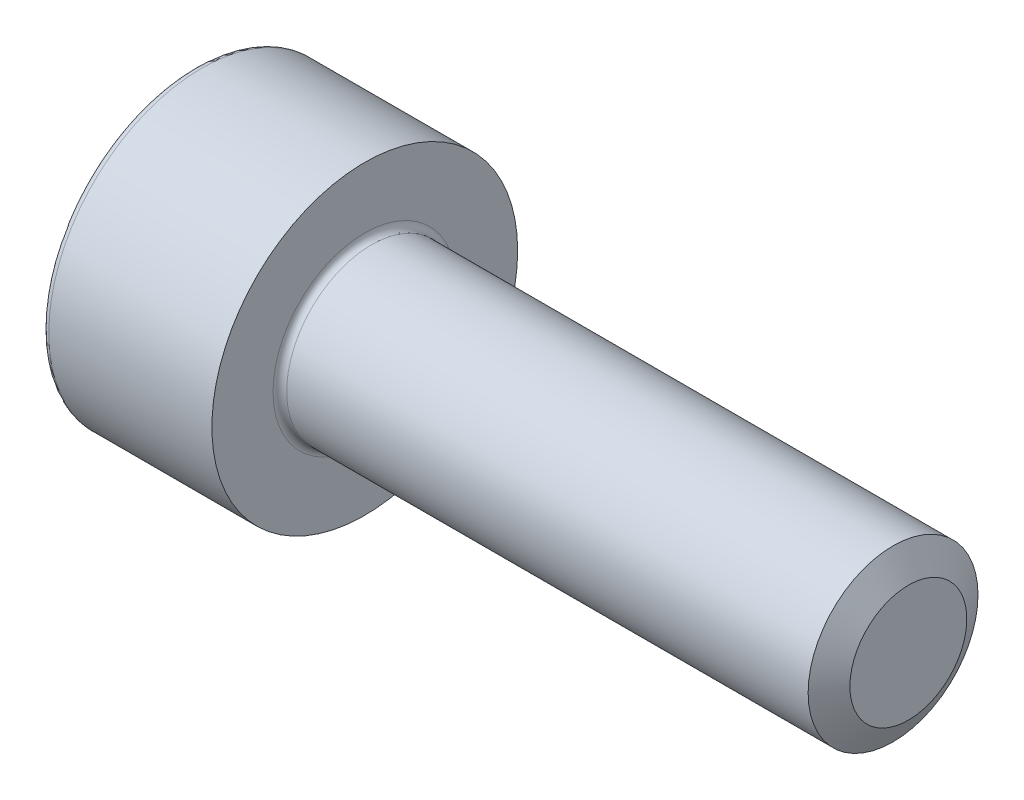
ISO-10303-21;
HEADER;
FILE_DESCRIPTION(('STEP AP214'),'2;1');
FILE_NAME('part.step','',(''),(''),'','','');
FILE_SCHEMA(('AUTOMOTIVE_DESIGN { 1 0 10303 214 1 1 1 1 }'));
ENDSEC;
DATA;
#1=APPLICATION_CONTEXT('core data for automotive mechanical design processes');
#2=APPLICATION_PROTOCOL_DEFINITION('international standard','automotive_design',2000,#1);
#3=PRODUCT_CONTEXT('',#1,'mechanical');
#4=PRODUCT('Part','Part','',(#3));
#5=PRODUCT_RELATED_PRODUCT_CATEGORY('part','',(#4));
#6=PRODUCT_DEFINITION_FORMATION('','',#4);
#7=PRODUCT_DEFINITION_CONTEXT('part definition',#1,'design');
#8=PRODUCT_DEFINITION('design','',#6,#7);
#9=PRODUCT_DEFINITION_SHAPE('','',#8);
#10=(LENGTH_UNIT() NAMED_UNIT(*) SI_UNIT(.MILLI.,.METRE.));
#11=(NAMED_UNIT(*) PLANE_ANGLE_UNIT() SI_UNIT($,.RADIAN.));
#12=(NAMED_UNIT(*) SI_UNIT($,.STERADIAN.) SOLID_ANGLE_UNIT());
#13=UNCERTAINTY_MEASURE_WITH_UNIT(LENGTH_MEASURE(1.E-05),#10,'distance_accuracy_value','');
#14=(GEOMETRIC_REPRESENTATION_CONTEXT(3) GLOBAL_UNCERTAINTY_ASSIGNED_CONTEXT((#13)) GLOBAL_UNIT_ASSIGNED_CONTEXT((#10,
#11,#12)) REPRESENTATION_CONTEXT('',''));
#15=CARTESIAN_POINT('',(0.,0.,0.));
#16=DIRECTION('',(0.,0.,1.));
#17=DIRECTION('',(1.,0.,0.));
#18=AXIS2_PLACEMENT_3D('',#15,#16,#17);
#19=CARTESIAN_POINT('',(0.,0.,0.));
#20=DIRECTION('',(1.,0.,0.));
#21=DIRECTION('',(0.,0.,-1.));
#22=AXIS2_PLACEMENT_3D('',#19,#20,#21);
#23=CYLINDRICAL_SURFACE('',#22,1.25);
#24=CARTESIAN_POINT('',(2.6,0.,0.));
#25=DIRECTION('',(1.,0.,0.));
#26=DIRECTION('',(0.,0.,-1.));
#27=AXIS2_PLACEMENT_3D('',#24,#25,#26);
#28=CIRCLE('',#27,1.25);
#29=CARTESIAN_POINT('',(2.6,0.,-1.25));
#30=VERTEX_POINT('',#29);
#31=EDGE_CURVE('E143',#30,#30,#28,.T.);
#32=ORIENTED_EDGE('',*,*,#31,.T.);
#33=EDGE_LOOP('',(#32));
#34=FACE_BOUND('',#33,.T.);
#35=CARTESIAN_POINT('',(10.275,0.,0.));
#36=DIRECTION('',(-1.,0.,0.));
#37=DIRECTION('',(0.,0.,1.));
#38=AXIS2_PLACEMENT_3D('',#35,#36,#37);
#39=CIRCLE('',#38,1.25);
#40=CARTESIAN_POINT('',(10.275,0.,1.25));
#41=VERTEX_POINT('',#40);
#42=EDGE_CURVE('E313',#41,#41,#39,.T.);
#43=ORIENTED_EDGE('',*,*,#42,.T.);
#44=EDGE_LOOP('',(#43));
#45=FACE_BOUND('',#44,.T.);
#46=ADVANCED_FACE('F40',(#34,#45),#23,.T.);
#47=CARTESIAN_POINT('',(0.,0.,0.));
#48=DIRECTION('',(-1.,0.,0.));
#49=DIRECTION('',(0.,0.,1.));
#50=AXIS2_PLACEMENT_3D('',#47,#48,#49);
#51=PLANE('',#50);
#52=CARTESIAN_POINT('',(0.,0.,0.));
#53=DIRECTION('',(-1.,0.,0.));
#54=DIRECTION('',(0.,0.,1.));
#55=AXIS2_PLACEMENT_3D('',#52,#53,#54);
#56=CIRCLE('',#55,2.15);
#57=CARTESIAN_POINT('',(0.,0.,2.15));
#58=VERTEX_POINT('',#57);
#59=EDGE_CURVE('E11',#58,#58,#56,.T.);
#60=ORIENTED_EDGE('',*,*,#59,.T.);
#61=EDGE_LOOP('',(#60));
#62=FACE_BOUND('',#61,.T.);
#63=DIRECTION('',(0.,0.5,0.866025403784439));
#64=VECTOR('',#63,1.);
#65=CARTESIAN_POINT('',(0.,-1.15,0.));
#66=LINE('',#65,#64);
#67=CARTESIAN_POINT('',(0.,-1.15,0.));
#68=VERTEX_POINT('',#67);
#69=CARTESIAN_POINT('',(0.,-0.575,0.995929214352104));
#70=VERTEX_POINT('',#69);
#71=EDGE_CURVE('E55',#68,#70,#66,.T.);
#72=ORIENTED_EDGE('',*,*,#71,.F.);
#73=DIRECTION('',(0.,-0.5,0.866025403784439));
#74=VECTOR('',#73,1.);
#75=CARTESIAN_POINT('',(0.,-0.575,-0.995929214352104));
#76=LINE('',#75,#74);
#77=CARTESIAN_POINT('',(0.,-0.575,-0.995929214352104));
#78=VERTEX_POINT('',#77);
#79=EDGE_CURVE('E139',#78,#68,#76,.T.);
#80=ORIENTED_EDGE('',*,*,#79,.F.);
#81=DIRECTION('',(0.,-1.,0.));
#82=VECTOR('',#81,1.);
#83=CARTESIAN_POINT('',(0.,0.575,-0.995929214352104));
#84=LINE('',#83,#82);
#85=CARTESIAN_POINT('',(0.,0.575,-0.995929214352104));
#86=VERTEX_POINT('',#85);
#87=EDGE_CURVE('E137',#86,#78,#84,.T.);
#88=ORIENTED_EDGE('',*,*,#87,.F.);
#89=DIRECTION('',(0.,-0.5,-0.866025403784439));
#90=VECTOR('',#89,1.);
#91=CARTESIAN_POINT('',(0.,1.15,0.));
#92=LINE('',#91,#90);
#93=CARTESIAN_POINT('',(0.,1.15,0.));
#94=VERTEX_POINT('',#93);
#95=EDGE_CURVE('E103',#94,#86,#92,.T.);
#96=ORIENTED_EDGE('',*,*,#95,.F.);
#97=DIRECTION('',(0.,0.5,-0.866025403784439));
#98=VECTOR('',#97,1.);
#99=CARTESIAN_POINT('',(0.,0.575,0.995929214352104));
#100=LINE('',#99,#98);
#101=CARTESIAN_POINT('',(0.,0.575,0.995929214352104));
#102=VERTEX_POINT('',#101);
#103=EDGE_CURVE('E133',#102,#94,#100,.T.);
#104=ORIENTED_EDGE('',*,*,#103,.F.);
#105=DIRECTION('',(0.,1.,0.));
#106=VECTOR('',#105,1.);
#107=CARTESIAN_POINT('',(0.,-0.575,0.995929214352104));
#108=LINE('',#107,#106);
#109=EDGE_CURVE('E129',#70,#102,#108,.T.);
#110=ORIENTED_EDGE('',*,*,#109,.F.);
#111=EDGE_LOOP('',(#72,#80,#88,#96,#104,#110));
#112=FACE_BOUND('',#111,.T.);
#113=ADVANCED_FACE('F177',(#62,#112),#51,.T.);
#114=CARTESIAN_POINT('',(0.,0.,0.));
#115=DIRECTION('',(1.,0.,0.));
#116=DIRECTION('',(0.,0.,-1.));
#117=AXIS2_PLACEMENT_3D('',#114,#115,#116);
#118=CYLINDRICAL_SURFACE('',#117,2.25);
#119=CARTESIAN_POINT('',(0.1,0.,0.));
#120=DIRECTION('',(-1.,0.,0.));
#121=DIRECTION('',(0.,0.,1.));
#122=AXIS2_PLACEMENT_3D('',#119,#120,#121);
#123=CIRCLE('',#122,2.25);
#124=CARTESIAN_POINT('',(0.1,0.,2.25));
#125=VERTEX_POINT('',#124);
#126=EDGE_CURVE('E48',#125,#125,#123,.F.);
#127=ORIENTED_EDGE('',*,*,#126,.T.);
#128=EDGE_LOOP('',(#127));
#129=FACE_BOUND('',#128,.T.);
#130=CARTESIAN_POINT('',(2.5,0.,0.));
#131=DIRECTION('',(1.,0.,0.));
#132=DIRECTION('',(0.,0.,-1.));
#133=AXIS2_PLACEMENT_3D('',#130,#131,#132);
#134=CIRCLE('',#133,2.25);
#135=CARTESIAN_POINT('',(2.5,0.,-2.25));
#136=VERTEX_POINT('',#135);
#137=EDGE_CURVE('E154',#136,#136,#134,.T.);
#138=ORIENTED_EDGE('',*,*,#137,.F.);
#139=EDGE_LOOP('',(#138));
#140=FACE_BOUND('',#139,.T.);
#141=ADVANCED_FACE('F160',(#129,#140),#118,.T.);
#142=CARTESIAN_POINT('',(2.5,2.25,0.));
#143=DIRECTION('',(1.,0.,0.));
#144=DIRECTION('',(0.,0.,-1.));
#145=AXIS2_PLACEMENT_3D('',#142,#143,#144);
#146=PLANE('',#145);
#147=ORIENTED_EDGE('',*,*,#137,.T.);
#148=EDGE_LOOP('',(#147));
#149=FACE_BOUND('',#148,.T.);
#150=CARTESIAN_POINT('',(2.5,0.,0.));
#151=DIRECTION('',(1.,0.,0.));
#152=DIRECTION('',(0.,0.,-1.));
#153=AXIS2_PLACEMENT_3D('',#150,#151,#152);
#154=CIRCLE('',#153,1.35);
#155=CARTESIAN_POINT('',(2.5,0.,-1.35));
#156=VERTEX_POINT('',#155);
#157=EDGE_CURVE('E151',#156,#156,#154,.T.);
#158=ORIENTED_EDGE('',*,*,#157,.F.);
#159=EDGE_LOOP('',(#158));
#160=FACE_BOUND('',#159,.T.);
#161=ADVANCED_FACE('F192',(#149,#160),#146,.T.);
#162=CARTESIAN_POINT('',(2.6,0.,0.));
#163=DIRECTION('',(1.,0.,0.));
#164=DIRECTION('',(0.,0.,-1.));
#165=AXIS2_PLACEMENT_3D('',#162,#163,#164);
#166=TOROIDAL_SURFACE('',#165,1.35,0.0999999999999997);
#167=ORIENTED_EDGE('',*,*,#157,.T.);
#168=EDGE_LOOP('',(#167));
#169=FACE_BOUND('',#168,.T.);
#170=ORIENTED_EDGE('',*,*,#31,.F.);
#171=EDGE_LOOP('',(#170));
#172=FACE_BOUND('',#171,.T.);
#173=ADVANCED_FACE('F188',(#169,#172),#166,.F.);
#174=CARTESIAN_POINT('',(1.1,-1.15,0.));
#175=DIRECTION('',(0.,-0.866025403784439,0.5));
#176=DIRECTION('',(0.,-0.5,-0.866025403784439));
#177=AXIS2_PLACEMENT_3D('',#174,#175,#176);
#178=PLANE('',#177);
#179=ORIENTED_EDGE('',*,*,#71,.T.);
#180=DIRECTION('',(-1.,0.,0.));
#181=VECTOR('',#180,1.);
#182=CARTESIAN_POINT('',(1.1,-0.575,0.995929214352104));
#183=LINE('',#182,#181);
#184=CARTESIAN_POINT('',(1.1,-0.575,0.995929214352104));
#185=VERTEX_POINT('',#184);
#186=EDGE_CURVE('E85',#185,#70,#183,.T.);
#187=ORIENTED_EDGE('',*,*,#186,.F.);
#188=DIRECTION('',(0.,0.5,0.866025403784439));
#189=VECTOR('',#188,1.);
#190=CARTESIAN_POINT('',(1.1,-1.15,0.));
#191=LINE('',#190,#189);
#192=CARTESIAN_POINT('',(1.1,-1.15,0.));
#193=VERTEX_POINT('',#192);
#194=EDGE_CURVE('E141',#193,#185,#191,.T.);
#195=ORIENTED_EDGE('',*,*,#194,.F.);
#196=DIRECTION('',(-1.,0.,0.));
#197=VECTOR('',#196,1.);
#198=CARTESIAN_POINT('',(1.1,-1.15,0.));
#199=LINE('',#198,#197);
#200=EDGE_CURVE('E63',#193,#68,#199,.T.);
#201=ORIENTED_EDGE('',*,*,#200,.T.);
#202=EDGE_LOOP('',(#179,#187,#195,#201));
#203=FACE_BOUND('',#202,.T.);
#204=ADVANCED_FACE('F191',(#203),#178,.F.);
#205=CARTESIAN_POINT('',(1.1,-0.575,-0.995929214352104));
#206=DIRECTION('',(0.,-0.866025403784439,-0.5));
#207=DIRECTION('',(0.,0.5,-0.866025403784439));
#208=AXIS2_PLACEMENT_3D('',#205,#206,#207);
#209=PLANE('',#208);
#210=ORIENTED_EDGE('',*,*,#79,.T.);
#211=ORIENTED_EDGE('',*,*,#200,.F.);
#212=DIRECTION('',(0.,-0.5,0.866025403784439));
#213=VECTOR('',#212,1.);
#214=CARTESIAN_POINT('',(1.1,-0.575,-0.995929214352104));
#215=LINE('',#214,#213);
#216=CARTESIAN_POINT('',(1.1,-0.575,-0.995929214352104));
#217=VERTEX_POINT('',#216);
#218=EDGE_CURVE('E115',#217,#193,#215,.T.);
#219=ORIENTED_EDGE('',*,*,#218,.F.);
#220=DIRECTION('',(-1.,0.,0.));
#221=VECTOR('',#220,1.);
#222=CARTESIAN_POINT('',(1.1,-0.575,-0.995929214352104));
#223=LINE('',#222,#221);
#224=EDGE_CURVE('E107',#217,#78,#223,.T.);
#225=ORIENTED_EDGE('',*,*,#224,.T.);
#226=EDGE_LOOP('',(#210,#211,#219,#225));
#227=FACE_BOUND('',#226,.T.);
#228=ADVANCED_FACE('F217',(#227),#209,.F.);
#229=CARTESIAN_POINT('',(1.1,0.575,-0.995929214352104));
#230=DIRECTION('',(0.,0.,-1.));
#231=DIRECTION('',(-1.,0.,0.));
#232=AXIS2_PLACEMENT_3D('',#229,#230,#231);
#233=PLANE('',#232);
#234=ORIENTED_EDGE('',*,*,#87,.T.);
#235=ORIENTED_EDGE('',*,*,#224,.F.);
#236=DIRECTION('',(0.,-1.,0.));
#237=VECTOR('',#236,1.);
#238=CARTESIAN_POINT('',(1.1,0.575,-0.995929214352104));
#239=LINE('',#238,#237);
#240=CARTESIAN_POINT('',(1.1,0.575,-0.995929214352104));
#241=VERTEX_POINT('',#240);
#242=EDGE_CURVE('E111',#241,#217,#239,.T.);
#243=ORIENTED_EDGE('',*,*,#242,.F.);
#244=DIRECTION('',(-1.,0.,0.));
#245=VECTOR('',#244,1.);
#246=CARTESIAN_POINT('',(1.1,0.575,-0.995929214352104));
#247=LINE('',#246,#245);
#248=EDGE_CURVE('E96',#241,#86,#247,.T.);
#249=ORIENTED_EDGE('',*,*,#248,.T.);
#250=EDGE_LOOP('',(#234,#235,#243,#249));
#251=FACE_BOUND('',#250,.T.);
#252=ADVANCED_FACE('F112',(#251),#233,.F.);
#253=CARTESIAN_POINT('',(1.1,1.15,0.));
#254=DIRECTION('',(0.,0.866025403784439,-0.5));
#255=DIRECTION('',(0.,0.5,0.866025403784439));
#256=AXIS2_PLACEMENT_3D('',#253,#254,#255);
#257=PLANE('',#256);
#258=ORIENTED_EDGE('',*,*,#95,.T.);
#259=ORIENTED_EDGE('',*,*,#248,.F.);
#260=DIRECTION('',(0.,-0.5,-0.866025403784439));
#261=VECTOR('',#260,1.);
#262=CARTESIAN_POINT('',(1.1,1.15,0.));
#263=LINE('',#262,#261);
#264=CARTESIAN_POINT('',(1.1,1.15,0.));
#265=VERTEX_POINT('',#264);
#266=EDGE_CURVE('E100',#265,#241,#263,.T.);
#267=ORIENTED_EDGE('',*,*,#266,.F.);
#268=DIRECTION('',(-1.,0.,0.));
#269=VECTOR('',#268,1.);
#270=CARTESIAN_POINT('',(1.1,1.15,0.));
#271=LINE('',#270,#269);
#272=EDGE_CURVE('E108',#265,#94,#271,.T.);
#273=ORIENTED_EDGE('',*,*,#272,.T.);
#274=EDGE_LOOP('',(#258,#259,#267,#273));
#275=FACE_BOUND('',#274,.T.);
#276=ADVANCED_FACE('F98',(#275),#257,.F.);
#277=CARTESIAN_POINT('',(1.1,0.575,0.995929214352104));
#278=DIRECTION('',(0.,0.866025403784439,0.5));
#279=DIRECTION('',(0.,-0.5,0.866025403784439));
#280=AXIS2_PLACEMENT_3D('',#277,#278,#279);
#281=PLANE('',#280);
#282=ORIENTED_EDGE('',*,*,#103,.T.);
#283=ORIENTED_EDGE('',*,*,#272,.F.);
#284=DIRECTION('',(0.,0.5,-0.866025403784439));
#285=VECTOR('',#284,1.);
#286=CARTESIAN_POINT('',(1.1,0.575,0.995929214352104));
#287=LINE('',#286,#285);
#288=CARTESIAN_POINT('',(1.1,0.575,0.995929214352104));
#289=VERTEX_POINT('',#288);
#290=EDGE_CURVE('E121',#289,#265,#287,.T.);
#291=ORIENTED_EDGE('',*,*,#290,.F.);
#292=DIRECTION('',(-1.,0.,0.));
#293=VECTOR('',#292,1.);
#294=CARTESIAN_POINT('',(1.1,0.575,0.995929214352104));
#295=LINE('',#294,#293);
#296=EDGE_CURVE('E146',#289,#102,#295,.T.);
#297=ORIENTED_EDGE('',*,*,#296,.T.);
#298=EDGE_LOOP('',(#282,#283,#291,#297));
#299=FACE_BOUND('',#298,.T.);
#300=ADVANCED_FACE('F235',(#299),#281,.F.);
#301=CARTESIAN_POINT('',(1.1,-0.575,0.995929214352104));
#302=DIRECTION('',(0.,0.,1.));
#303=DIRECTION('',(0.,-1.,0.));
#304=AXIS2_PLACEMENT_3D('',#301,#302,#303);
#305=PLANE('',#304);
#306=ORIENTED_EDGE('',*,*,#109,.T.);
#307=ORIENTED_EDGE('',*,*,#296,.F.);
#308=DIRECTION('',(0.,1.,0.));
#309=VECTOR('',#308,1.);
#310=CARTESIAN_POINT('',(1.1,-0.575,0.995929214352104));
#311=LINE('',#310,#309);
#312=EDGE_CURVE('E123',#185,#289,#311,.T.);
#313=ORIENTED_EDGE('',*,*,#312,.F.);
#314=ORIENTED_EDGE('',*,*,#186,.T.);
#315=EDGE_LOOP('',(#306,#307,#313,#314));
#316=FACE_BOUND('',#315,.T.);
#317=ADVANCED_FACE('F173',(#316),#305,.F.);
#318=CARTESIAN_POINT('',(1.1,-0.575,0.995929214352104));
#319=DIRECTION('',(-1.,0.,0.));
#320=DIRECTION('',(0.,0.,1.));
#321=AXIS2_PLACEMENT_3D('',#318,#319,#320);
#322=PLANE('',#321);
#323=ORIENTED_EDGE('',*,*,#194,.T.);
#324=ORIENTED_EDGE('',*,*,#312,.T.);
#325=ORIENTED_EDGE('',*,*,#290,.T.);
#326=ORIENTED_EDGE('',*,*,#266,.T.);
#327=ORIENTED_EDGE('',*,*,#242,.T.);
#328=ORIENTED_EDGE('',*,*,#218,.T.);
#329=EDGE_LOOP('',(#323,#324,#325,#326,#327,#328));
#330=FACE_BOUND('',#329,.T.);
#331=ADVANCED_FACE('F118',(#330),#322,.T.);
#332=CARTESIAN_POINT('',(0.1,0.,0.));
#333=DIRECTION('',(-1.,0.,0.));
#334=DIRECTION('',(0.,0.,1.));
#335=AXIS2_PLACEMENT_3D('',#332,#333,#334);
#336=TOROIDAL_SURFACE('',#335,2.15,0.1);
#337=ORIENTED_EDGE('',*,*,#59,.F.);
#338=EDGE_LOOP('',(#337));
#339=FACE_BOUND('',#338,.T.);
#340=ORIENTED_EDGE('',*,*,#126,.F.);
#341=EDGE_LOOP('',(#340));
#342=FACE_BOUND('',#341,.T.);
#343=ADVANCED_FACE('F42',(#339,#342),#336,.T.);
#344=CARTESIAN_POINT('',(10.275,0.,0.));
#345=DIRECTION('',(-1.,0.,0.));
#346=DIRECTION('',(0.,0.,1.));
#347=AXIS2_PLACEMENT_3D('',#344,#345,#346);
#348=CONICAL_SURFACE('',#347,1.25,1.04718484902493);
#349=CARTESIAN_POINT('',(10.5,0.,0.));
#350=DIRECTION('',(-1.,0.,0.));
#351=DIRECTION('',(0.,0.,1.));
#352=AXIS2_PLACEMENT_3D('',#349,#350,#351);
#353=CIRCLE('',#352,0.8603);
#354=CARTESIAN_POINT('',(10.5,0.,0.8603));
#355=VERTEX_POINT('',#354);
#356=EDGE_CURVE('E130',#355,#355,#353,.T.);
#357=ORIENTED_EDGE('',*,*,#356,.T.);
#358=EDGE_LOOP('',(#357));
#359=FACE_BOUND('',#358,.T.);
#360=ORIENTED_EDGE('',*,*,#42,.F.);
#361=EDGE_LOOP('',(#360));
#362=FACE_BOUND('',#361,.T.);
#363=ADVANCED_FACE('F164',(#359,#362),#348,.T.);
#364=CARTESIAN_POINT('',(10.5,1.25,0.));
#365=DIRECTION('',(1.,0.,0.));
#366=DIRECTION('',(0.,0.,-1.));
#367=AXIS2_PLACEMENT_3D('',#364,#365,#366);
#368=PLANE('',#367);
#369=ORIENTED_EDGE('',*,*,#356,.F.);
#370=EDGE_LOOP('',(#369));
#371=FACE_BOUND('',#370,.T.);
#372=ADVANCED_FACE('F170',(#371),#368,.T.);
#373=CLOSED_SHELL('',(#46,#113,#141,#161,#173,#204,#228,#252,#276,#300,#317,#331,#343,#363,#372));
#374=MANIFOLD_SOLID_BREP('B2',#373);
#375=ADVANCED_BREP_SHAPE_REPRESENTATION('',(#18,#374),#14);
#376=SHAPE_DEFINITION_REPRESENTATION(#9,#375);
ENDSEC;
END-ISO-10303-21;
